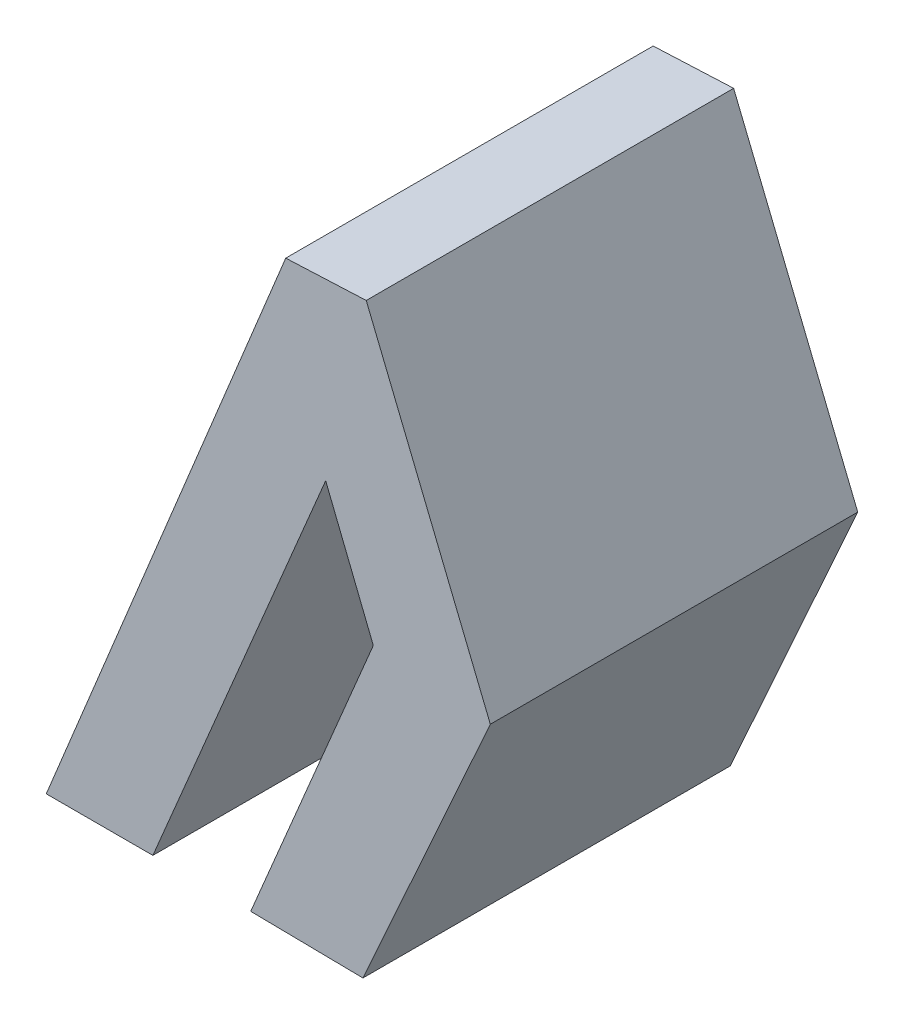
ISO-10303-21;
HEADER;
FILE_DESCRIPTION(('STEP AP214'),'2;1');
FILE_NAME('part.step','',(''),(''),'','','');
FILE_SCHEMA(('AUTOMOTIVE_DESIGN { 1 0 10303 214 1 1 1 1 }'));
ENDSEC;
DATA;
#1=APPLICATION_CONTEXT('core data for automotive mechanical design processes');
#2=APPLICATION_PROTOCOL_DEFINITION('international standard','automotive_design',2000,#1);
#3=PRODUCT_CONTEXT('',#1,'mechanical');
#4=PRODUCT('Part','Part','',(#3));
#5=PRODUCT_RELATED_PRODUCT_CATEGORY('part','',(#4));
#6=PRODUCT_DEFINITION_FORMATION('','',#4);
#7=PRODUCT_DEFINITION_CONTEXT('part definition',#1,'design');
#8=PRODUCT_DEFINITION('design','',#6,#7);
#9=PRODUCT_DEFINITION_SHAPE('','',#8);
#10=(LENGTH_UNIT() NAMED_UNIT(*) SI_UNIT(.MILLI.,.METRE.));
#11=(NAMED_UNIT(*) PLANE_ANGLE_UNIT() SI_UNIT($,.RADIAN.));
#12=(NAMED_UNIT(*) SI_UNIT($,.STERADIAN.) SOLID_ANGLE_UNIT());
#13=UNCERTAINTY_MEASURE_WITH_UNIT(LENGTH_MEASURE(1.E-05),#10,'distance_accuracy_value','');
#14=(GEOMETRIC_REPRESENTATION_CONTEXT(3) GLOBAL_UNCERTAINTY_ASSIGNED_CONTEXT((#13)) GLOBAL_UNIT_ASSIGNED_CONTEXT((#10,
#11,#12)) REPRESENTATION_CONTEXT('',''));
#15=CARTESIAN_POINT('',(0.,0.,0.));
#16=DIRECTION('',(0.,0.,1.));
#17=DIRECTION('',(1.,0.,0.));
#18=AXIS2_PLACEMENT_3D('',#15,#16,#17);
#19=CARTESIAN_POINT('',(5.961420135137,1.350232045556,0.));
#20=DIRECTION('',(-0.044677004400389,0.999001484121925,0.));
#21=DIRECTION('',(-0.999001484121925,-0.044677004400389,0.));
#22=AXIS2_PLACEMENT_3D('',#19,#20,#21);
#23=PLANE('',#22);
#24=DIRECTION('',(-0.999001484121925,-0.044677004400389,0.));
#25=VECTOR('',#24,1.);
#26=CARTESIAN_POINT('',(5.961420135137,1.350232045556,0.));
#27=LINE('',#26,#25);
#28=CARTESIAN_POINT('',(5.961420135137,1.350232045556,0.));
#29=VERTEX_POINT('',#28);
#30=CARTESIAN_POINT('',(5.93951290235,1.349252317747,0.));
#31=VERTEX_POINT('',#30);
#32=EDGE_CURVE('E11',#29,#31,#27,.T.);
#33=ORIENTED_EDGE('',*,*,#32,.T.);
#34=DIRECTION('',(0.,0.,1.));
#35=VECTOR('',#34,1.);
#36=CARTESIAN_POINT('',(5.93951290235,1.349252317747,0.));
#37=LINE('',#36,#35);
#38=CARTESIAN_POINT('',(5.93951290235,1.349252317747,0.1));
#39=VERTEX_POINT('',#38);
#40=EDGE_CURVE('E24',#31,#39,#37,.T.);
#41=ORIENTED_EDGE('',*,*,#40,.T.);
#42=DIRECTION('',(-0.999001484121925,-0.044677004400389,0.));
#43=VECTOR('',#42,1.);
#44=CARTESIAN_POINT('',(5.961420135137,1.350232045556,0.1));
#45=LINE('',#44,#43);
#46=CARTESIAN_POINT('',(5.961420135137,1.350232045556,0.1));
#47=VERTEX_POINT('',#46);
#48=EDGE_CURVE('E106',#47,#39,#45,.T.);
#49=ORIENTED_EDGE('',*,*,#48,.F.);
#50=DIRECTION('',(0.,0.,1.));
#51=VECTOR('',#50,1.);
#52=CARTESIAN_POINT('',(5.961420135137,1.350232045556,0.));
#53=LINE('',#52,#51);
#54=EDGE_CURVE('E161',#29,#47,#53,.T.);
#55=ORIENTED_EDGE('',*,*,#54,.F.);
#56=EDGE_LOOP('',(#33,#41,#49,#55));
#57=FACE_BOUND('',#56,.T.);
#58=ADVANCED_FACE('F17',(#57),#23,.T.);
#59=CARTESIAN_POINT('',(5.995195541538,1.267226919307,0.));
#60=DIRECTION('',(0.926254074513296,0.376899707412353,0.));
#61=DIRECTION('',(-0.376899707412353,0.926254074513296,0.));
#62=AXIS2_PLACEMENT_3D('',#59,#60,#61);
#63=PLANE('',#62);
#64=DIRECTION('',(-0.376899707412353,0.926254074513296,0.));
#65=VECTOR('',#64,1.);
#66=CARTESIAN_POINT('',(5.995195541538,1.267226919307,0.));
#67=LINE('',#66,#65);
#68=CARTESIAN_POINT('',(5.995195541538,1.267226919307,0.));
#69=VERTEX_POINT('',#68);
#70=EDGE_CURVE('E158',#69,#29,#67,.T.);
#71=ORIENTED_EDGE('',*,*,#70,.T.);
#72=ORIENTED_EDGE('',*,*,#54,.T.);
#73=DIRECTION('',(-0.376899707412353,0.926254074513296,0.));
#74=VECTOR('',#73,1.);
#75=CARTESIAN_POINT('',(5.995195541538,1.267226919307,0.1));
#76=LINE('',#75,#74);
#77=CARTESIAN_POINT('',(5.995195541538,1.267226919307,0.1));
#78=VERTEX_POINT('',#77);
#79=EDGE_CURVE('E156',#78,#47,#76,.T.);
#80=ORIENTED_EDGE('',*,*,#79,.F.);
#81=DIRECTION('',(0.,0.,1.));
#82=VECTOR('',#81,1.);
#83=CARTESIAN_POINT('',(5.995195541538,1.267226919307,0.));
#84=LINE('',#83,#82);
#85=EDGE_CURVE('E153',#69,#78,#84,.T.);
#86=ORIENTED_EDGE('',*,*,#85,.F.);
#87=EDGE_LOOP('',(#71,#72,#80,#86));
#88=FACE_BOUND('',#87,.T.);
#89=ADVANCED_FACE('F181',(#88),#63,.T.);
#90=CARTESIAN_POINT('',(5.960523427912,1.190077869609,0.));
#91=DIRECTION('',(0.912120311007866,-0.409922600312441,0.));
#92=DIRECTION('',(0.409922600312441,0.912120311007866,0.));
#93=AXIS2_PLACEMENT_3D('',#90,#91,#92);
#94=PLANE('',#93);
#95=DIRECTION('',(0.409922600312441,0.912120311007866,0.));
#96=VECTOR('',#95,1.);
#97=CARTESIAN_POINT('',(5.960523427912,1.190077869609,0.));
#98=LINE('',#97,#96);
#99=CARTESIAN_POINT('',(5.960523427912,1.190077869609,0.));
#100=VERTEX_POINT('',#99);
#101=EDGE_CURVE('E150',#100,#69,#98,.T.);
#102=ORIENTED_EDGE('',*,*,#101,.T.);
#103=ORIENTED_EDGE('',*,*,#85,.T.);
#104=DIRECTION('',(0.409922600312441,0.912120311007866,0.));
#105=VECTOR('',#104,1.);
#106=CARTESIAN_POINT('',(5.960523427912,1.190077869609,0.1));
#107=LINE('',#106,#105);
#108=CARTESIAN_POINT('',(5.960523427912,1.190077869609,0.1));
#109=VERTEX_POINT('',#108);
#110=EDGE_CURVE('E147',#109,#78,#107,.T.);
#111=ORIENTED_EDGE('',*,*,#110,.F.);
#112=DIRECTION('',(0.,0.,1.));
#113=VECTOR('',#112,1.);
#114=CARTESIAN_POINT('',(5.960523427912,1.190077869609,0.));
#115=LINE('',#114,#113);
#116=EDGE_CURVE('E144',#100,#109,#115,.T.);
#117=ORIENTED_EDGE('',*,*,#116,.F.);
#118=EDGE_LOOP('',(#102,#103,#111,#117));
#119=FACE_BOUND('',#118,.T.);
#120=ADVANCED_FACE('F178',(#119),#94,.T.);
#121=CARTESIAN_POINT('',(5.929980583831,1.190518968572,0.));
#122=DIRECTION('',(-0.014440468230911,-0.999895731002624,0.));
#123=DIRECTION('',(0.999895731002624,-0.014440468230911,0.));
#124=AXIS2_PLACEMENT_3D('',#121,#122,#123);
#125=PLANE('',#124);
#126=DIRECTION('',(0.999895731002624,-0.014440468230911,0.));
#127=VECTOR('',#126,1.);
#128=CARTESIAN_POINT('',(5.929980583831,1.190518968572,0.));
#129=LINE('',#128,#127);
#130=CARTESIAN_POINT('',(5.929980583831,1.190518968572,0.));
#131=VERTEX_POINT('',#130);
#132=EDGE_CURVE('E141',#131,#100,#129,.T.);
#133=ORIENTED_EDGE('',*,*,#132,.T.);
#134=ORIENTED_EDGE('',*,*,#116,.T.);
#135=DIRECTION('',(0.999895731002624,-0.014440468230911,0.));
#136=VECTOR('',#135,1.);
#137=CARTESIAN_POINT('',(5.929980583831,1.190518968572,0.1));
#138=LINE('',#137,#136);
#139=CARTESIAN_POINT('',(5.929980583831,1.190518968572,0.1));
#140=VERTEX_POINT('',#139);
#141=EDGE_CURVE('E138',#140,#109,#138,.T.);
#142=ORIENTED_EDGE('',*,*,#141,.F.);
#143=DIRECTION('',(0.,0.,1.));
#144=VECTOR('',#143,1.);
#145=CARTESIAN_POINT('',(5.929980583831,1.190518968572,0.));
#146=LINE('',#145,#144);
#147=EDGE_CURVE('E135',#131,#140,#146,.T.);
#148=ORIENTED_EDGE('',*,*,#147,.F.);
#149=EDGE_LOOP('',(#133,#134,#142,#148));
#150=FACE_BOUND('',#149,.T.);
#151=ADVANCED_FACE('F175',(#150),#125,.T.);
#152=CARTESIAN_POINT('',(5.963346226906,1.269862938179,0.));
#153=DIRECTION('',(-0.921811225000382,0.387639091763583,0.));
#154=DIRECTION('',(-0.387639091763583,-0.921811225000382,0.));
#155=AXIS2_PLACEMENT_3D('',#152,#153,#154);
#156=PLANE('',#155);
#157=DIRECTION('',(-0.387639091763583,-0.921811225000382,0.));
#158=VECTOR('',#157,1.);
#159=CARTESIAN_POINT('',(5.963346226906,1.269862938179,0.));
#160=LINE('',#159,#158);
#161=CARTESIAN_POINT('',(5.963346226906,1.269862938179,0.));
#162=VERTEX_POINT('',#161);
#163=EDGE_CURVE('E132',#162,#131,#160,.T.);
#164=ORIENTED_EDGE('',*,*,#163,.T.);
#165=ORIENTED_EDGE('',*,*,#147,.T.);
#166=DIRECTION('',(-0.387639091763583,-0.921811225000382,0.));
#167=VECTOR('',#166,1.);
#168=CARTESIAN_POINT('',(5.963346226906,1.269862938179,0.1));
#169=LINE('',#168,#167);
#170=CARTESIAN_POINT('',(5.963346226906,1.269862938179,0.1));
#171=VERTEX_POINT('',#170);
#172=EDGE_CURVE('E129',#171,#140,#169,.T.);
#173=ORIENTED_EDGE('',*,*,#172,.F.);
#174=DIRECTION('',(0.,0.,1.));
#175=VECTOR('',#174,1.);
#176=CARTESIAN_POINT('',(5.963346226906,1.269862938179,0.));
#177=LINE('',#176,#175);
#178=EDGE_CURVE('E126',#162,#171,#177,.T.);
#179=ORIENTED_EDGE('',*,*,#178,.F.);
#180=EDGE_LOOP('',(#164,#165,#173,#179));
#181=FACE_BOUND('',#180,.T.);
#182=ADVANCED_FACE('F172',(#181),#156,.T.);
#183=CARTESIAN_POINT('',(5.950380642992,1.302224890006,0.));
#184=DIRECTION('',(-0.9282707832571,-0.371905032167151,0.));
#185=DIRECTION('',(0.371905032167151,-0.9282707832571,0.));
#186=AXIS2_PLACEMENT_3D('',#183,#184,#185);
#187=PLANE('',#186);
#188=DIRECTION('',(0.371905032167151,-0.9282707832571,0.));
#189=VECTOR('',#188,1.);
#190=CARTESIAN_POINT('',(5.950380642992,1.302224890006,0.));
#191=LINE('',#190,#189);
#192=CARTESIAN_POINT('',(5.950380642992,1.302224890006,0.));
#193=VERTEX_POINT('',#192);
#194=EDGE_CURVE('E123',#193,#162,#191,.T.);
#195=ORIENTED_EDGE('',*,*,#194,.T.);
#196=ORIENTED_EDGE('',*,*,#178,.T.);
#197=DIRECTION('',(0.371905032167151,-0.9282707832571,0.));
#198=VECTOR('',#197,1.);
#199=CARTESIAN_POINT('',(5.950380642992,1.302224890006,0.1));
#200=LINE('',#199,#198);
#201=CARTESIAN_POINT('',(5.950380642992,1.302224890006,0.1));
#202=VERTEX_POINT('',#201);
#203=EDGE_CURVE('E120',#202,#171,#200,.T.);
#204=ORIENTED_EDGE('',*,*,#203,.F.);
#205=DIRECTION('',(0.,0.,1.));
#206=VECTOR('',#205,1.);
#207=CARTESIAN_POINT('',(5.950380642992,1.302224890006,0.));
#208=LINE('',#207,#206);
#209=EDGE_CURVE('E117',#193,#202,#208,.T.);
#210=ORIENTED_EDGE('',*,*,#209,.F.);
#211=EDGE_LOOP('',(#195,#196,#204,#210));
#212=FACE_BOUND('',#211,.T.);
#213=ADVANCED_FACE('F169',(#212),#187,.T.);
#214=CARTESIAN_POINT('',(5.903352153993,1.190390480179,0.));
#215=DIRECTION('',(0.921811225000387,-0.387639091763571,0.));
#216=DIRECTION('',(0.387639091763571,0.921811225000387,0.));
#217=AXIS2_PLACEMENT_3D('',#214,#215,#216);
#218=PLANE('',#217);
#219=DIRECTION('',(0.387639091763571,0.921811225000387,0.));
#220=VECTOR('',#219,1.);
#221=CARTESIAN_POINT('',(5.903352153993,1.190390480179,0.));
#222=LINE('',#221,#220);
#223=CARTESIAN_POINT('',(5.903352153993,1.190390480179,0.));
#224=VERTEX_POINT('',#223);
#225=EDGE_CURVE('E114',#224,#193,#222,.T.);
#226=ORIENTED_EDGE('',*,*,#225,.T.);
#227=ORIENTED_EDGE('',*,*,#209,.T.);
#228=DIRECTION('',(0.387639091763571,0.921811225000387,0.));
#229=VECTOR('',#228,1.);
#230=CARTESIAN_POINT('',(5.903352153993,1.190390480179,0.1));
#231=LINE('',#230,#229);
#232=CARTESIAN_POINT('',(5.903352153993,1.190390480179,0.1));
#233=VERTEX_POINT('',#232);
#234=EDGE_CURVE('E112',#233,#202,#231,.T.);
#235=ORIENTED_EDGE('',*,*,#234,.F.);
#236=DIRECTION('',(0.,0.,1.));
#237=VECTOR('',#236,1.);
#238=CARTESIAN_POINT('',(5.903352153993,1.190390480179,0.));
#239=LINE('',#238,#237);
#240=EDGE_CURVE('E91',#224,#233,#239,.T.);
#241=ORIENTED_EDGE('',*,*,#240,.F.);
#242=EDGE_LOOP('',(#226,#227,#235,#241));
#243=FACE_BOUND('',#242,.T.);
#244=ADVANCED_FACE('F167',(#243),#218,.T.);
#245=CARTESIAN_POINT('',(5.874333899818,1.190390480179,0.));
#246=DIRECTION('',(0.,-1.,0.));
#247=DIRECTION('',(1.,0.,0.));
#248=AXIS2_PLACEMENT_3D('',#245,#246,#247);
#249=PLANE('',#248);
#250=DIRECTION('',(1.,0.,0.));
#251=VECTOR('',#250,1.);
#252=CARTESIAN_POINT('',(5.874333899818,1.190390480179,0.));
#253=LINE('',#252,#251);
#254=CARTESIAN_POINT('',(5.874333899818,1.190390480179,0.));
#255=VERTEX_POINT('',#254);
#256=EDGE_CURVE('E95',#255,#224,#253,.T.);
#257=ORIENTED_EDGE('',*,*,#256,.T.);
#258=ORIENTED_EDGE('',*,*,#240,.T.);
#259=DIRECTION('',(1.,0.,0.));
#260=VECTOR('',#259,1.);
#261=CARTESIAN_POINT('',(5.874333899818,1.190390480179,0.1));
#262=LINE('',#261,#260);
#263=CARTESIAN_POINT('',(5.874333899818,1.190390480179,0.1));
#264=VERTEX_POINT('',#263);
#265=EDGE_CURVE('E84',#264,#233,#262,.T.);
#266=ORIENTED_EDGE('',*,*,#265,.F.);
#267=DIRECTION('',(0.,0.,1.));
#268=VECTOR('',#267,1.);
#269=CARTESIAN_POINT('',(5.874333899818,1.190390480179,0.));
#270=LINE('',#269,#268);
#271=EDGE_CURVE('E88',#255,#264,#270,.T.);
#272=ORIENTED_EDGE('',*,*,#271,.F.);
#273=EDGE_LOOP('',(#257,#258,#266,#272));
#274=FACE_BOUND('',#273,.T.);
#275=ADVANCED_FACE('F87',(#274),#249,.T.);
#276=CARTESIAN_POINT('',(5.93951290235,1.349252317747,0.));
#277=DIRECTION('',(-0.925158566200225,0.379580857507784,0.));
#278=DIRECTION('',(-0.379580857507784,-0.925158566200225,0.));
#279=AXIS2_PLACEMENT_3D('',#276,#277,#278);
#280=PLANE('',#279);
#281=DIRECTION('',(-0.379580857507784,-0.925158566200225,0.));
#282=VECTOR('',#281,1.);
#283=CARTESIAN_POINT('',(5.93951290235,1.349252317747,0.));
#284=LINE('',#283,#282);
#285=EDGE_CURVE('E101',#31,#255,#284,.T.);
#286=ORIENTED_EDGE('',*,*,#285,.T.);
#287=ORIENTED_EDGE('',*,*,#271,.T.);
#288=DIRECTION('',(-0.379580857507784,-0.925158566200225,0.));
#289=VECTOR('',#288,1.);
#290=CARTESIAN_POINT('',(5.93951290235,1.349252317747,0.1));
#291=LINE('',#290,#289);
#292=EDGE_CURVE('E100',#39,#264,#291,.T.);
#293=ORIENTED_EDGE('',*,*,#292,.F.);
#294=ORIENTED_EDGE('',*,*,#40,.F.);
#295=EDGE_LOOP('',(#286,#287,#293,#294));
#296=FACE_BOUND('',#295,.T.);
#297=ADVANCED_FACE('F99',(#296),#280,.T.);
#298=CARTESIAN_POINT('',(5.939147327893,1.256866740976,0.1));
#299=DIRECTION('',(0.,0.,1.));
#300=DIRECTION('',(1.,0.,0.));
#301=AXIS2_PLACEMENT_3D('',#298,#299,#300);
#302=PLANE('',#301);
#303=ORIENTED_EDGE('',*,*,#292,.T.);
#304=ORIENTED_EDGE('',*,*,#265,.T.);
#305=ORIENTED_EDGE('',*,*,#234,.T.);
#306=ORIENTED_EDGE('',*,*,#203,.T.);
#307=ORIENTED_EDGE('',*,*,#172,.T.);
#308=ORIENTED_EDGE('',*,*,#141,.T.);
#309=ORIENTED_EDGE('',*,*,#110,.T.);
#310=ORIENTED_EDGE('',*,*,#79,.T.);
#311=ORIENTED_EDGE('',*,*,#48,.T.);
#312=EDGE_LOOP('',(#303,#304,#305,#306,#307,#308,#309,#310,#311));
#313=FACE_BOUND('',#312,.T.);
#314=ADVANCED_FACE('F104',(#313),#302,.T.);
#315=CARTESIAN_POINT('',(5.939147327893,1.256866740976,0.));
#316=DIRECTION('',(0.,0.,1.));
#317=DIRECTION('',(1.,0.,0.));
#318=AXIS2_PLACEMENT_3D('',#315,#316,#317);
#319=PLANE('',#318);
#320=ORIENTED_EDGE('',*,*,#285,.F.);
#321=ORIENTED_EDGE('',*,*,#32,.F.);
#322=ORIENTED_EDGE('',*,*,#70,.F.);
#323=ORIENTED_EDGE('',*,*,#101,.F.);
#324=ORIENTED_EDGE('',*,*,#132,.F.);
#325=ORIENTED_EDGE('',*,*,#163,.F.);
#326=ORIENTED_EDGE('',*,*,#194,.F.);
#327=ORIENTED_EDGE('',*,*,#225,.F.);
#328=ORIENTED_EDGE('',*,*,#256,.F.);
#329=EDGE_LOOP('',(#320,#321,#322,#323,#324,#325,#326,#327,#328));
#330=FACE_BOUND('',#329,.T.);
#331=ADVANCED_FACE('F164',(#330),#319,.F.);
#332=CLOSED_SHELL('',(#58,#89,#120,#151,#182,#213,#244,#275,#297,#314,#331));
#333=MANIFOLD_SOLID_BREP('B1',#332);
#334=ADVANCED_BREP_SHAPE_REPRESENTATION('',(#18,#333),#14);
#335=SHAPE_DEFINITION_REPRESENTATION(#9,#334);
ENDSEC;
END-ISO-10303-21;
